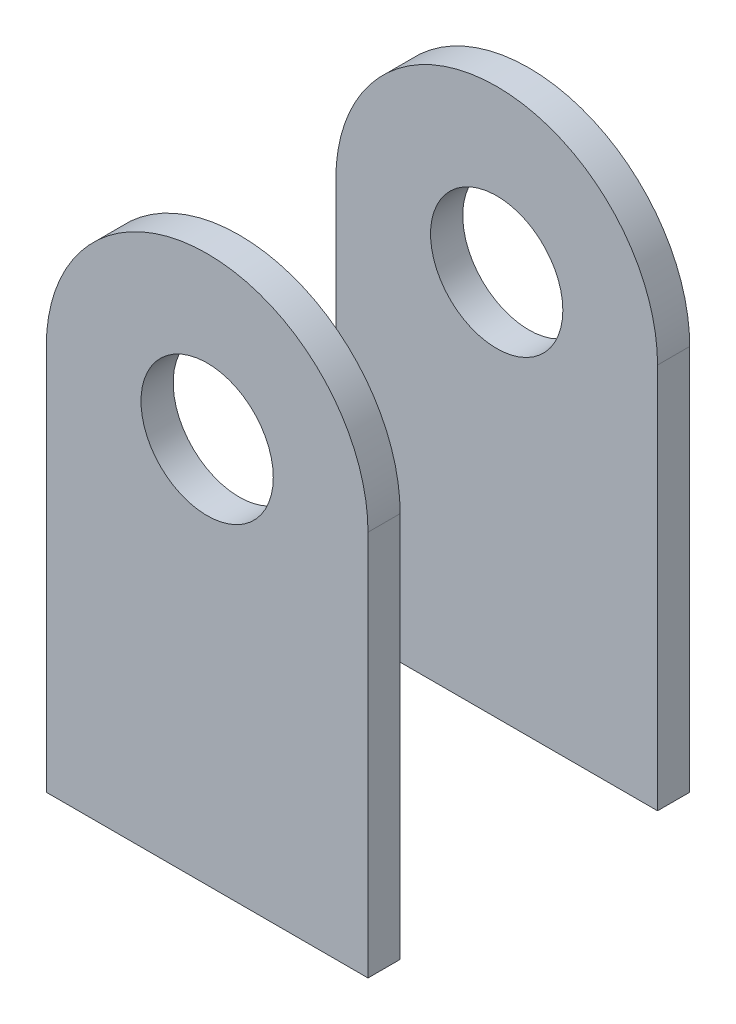
ISO-10303-21;
HEADER;
FILE_DESCRIPTION(('STEP AP214'),'2;1');
FILE_NAME('part.step','',(''),(''),'','','');
FILE_SCHEMA(('AUTOMOTIVE_DESIGN { 1 0 10303 214 1 1 1 1 }'));
ENDSEC;
DATA;
#1=APPLICATION_CONTEXT('core data for automotive mechanical design processes');
#2=APPLICATION_PROTOCOL_DEFINITION('international standard','automotive_design',2000,#1);
#3=PRODUCT_CONTEXT('',#1,'mechanical');
#4=PRODUCT('Part','Part','',(#3));
#5=PRODUCT_RELATED_PRODUCT_CATEGORY('part','',(#4));
#6=PRODUCT_DEFINITION_FORMATION('','',#4);
#7=PRODUCT_DEFINITION_CONTEXT('part definition',#1,'design');
#8=PRODUCT_DEFINITION('design','',#6,#7);
#9=PRODUCT_DEFINITION_SHAPE('','',#8);
#10=(LENGTH_UNIT() NAMED_UNIT(*) SI_UNIT(.MILLI.,.METRE.));
#11=(NAMED_UNIT(*) PLANE_ANGLE_UNIT() SI_UNIT($,.RADIAN.));
#12=(NAMED_UNIT(*) SI_UNIT($,.STERADIAN.) SOLID_ANGLE_UNIT());
#13=UNCERTAINTY_MEASURE_WITH_UNIT(LENGTH_MEASURE(1.E-05),#10,'distance_accuracy_value','');
#14=(GEOMETRIC_REPRESENTATION_CONTEXT(3) GLOBAL_UNCERTAINTY_ASSIGNED_CONTEXT((#13)) GLOBAL_UNIT_ASSIGNED_CONTEXT((#10,
#11,#12)) REPRESENTATION_CONTEXT('',''));
#15=CARTESIAN_POINT('',(0.,0.,0.));
#16=DIRECTION('',(0.,0.,1.));
#17=DIRECTION('',(1.,0.,0.));
#18=AXIS2_PLACEMENT_3D('',#15,#16,#17);
#19=CARTESIAN_POINT('',(0.,-19.05,-7.9375));
#20=DIRECTION('',(0.,1.,0.));
#21=DIRECTION('',(0.,0.,1.));
#22=AXIS2_PLACEMENT_3D('',#19,#20,#21);
#23=PLANE('',#22);
#24=DIRECTION('',(-1.,0.,0.));
#25=VECTOR('',#24,1.);
#26=CARTESIAN_POINT('',(0.,-19.05,-6.35));
#27=LINE('',#26,#25);
#28=CARTESIAN_POINT('',(7.9375,-19.05,-6.35));
#29=VERTEX_POINT('',#28);
#30=CARTESIAN_POINT('',(-7.9375,-19.05,-6.35));
#31=VERTEX_POINT('',#30);
#32=EDGE_CURVE('E121',#29,#31,#27,.T.);
#33=ORIENTED_EDGE('',*,*,#32,.T.);
#34=DIRECTION('',(0.,0.,1.));
#35=VECTOR('',#34,1.);
#36=CARTESIAN_POINT('',(-7.9375,-19.05,-7.9375));
#37=LINE('',#36,#35);
#38=CARTESIAN_POINT('',(-7.9375,-19.05,-7.9375));
#39=VERTEX_POINT('',#38);
#40=EDGE_CURVE('E12',#39,#31,#37,.T.);
#41=ORIENTED_EDGE('',*,*,#40,.F.);
#42=DIRECTION('',(-1.,0.,0.));
#43=VECTOR('',#42,1.);
#44=CARTESIAN_POINT('',(0.,-19.05,-7.9375));
#45=LINE('',#44,#43);
#46=CARTESIAN_POINT('',(7.9375,-19.05,-7.9375));
#47=VERTEX_POINT('',#46);
#48=EDGE_CURVE('E110',#47,#39,#45,.T.);
#49=ORIENTED_EDGE('',*,*,#48,.F.);
#50=DIRECTION('',(0.,0.,1.));
#51=VECTOR('',#50,1.);
#52=CARTESIAN_POINT('',(7.9375,-19.05,-7.9375));
#53=LINE('',#52,#51);
#54=EDGE_CURVE('E56',#47,#29,#53,.T.);
#55=ORIENTED_EDGE('',*,*,#54,.T.);
#56=EDGE_LOOP('',(#33,#41,#49,#55));
#57=FACE_BOUND('',#56,.T.);
#58=ADVANCED_FACE('F53',(#57),#23,.F.);
#59=CARTESIAN_POINT('',(-7.9375,0.,-7.9375));
#60=DIRECTION('',(1.,0.,0.));
#61=DIRECTION('',(0.,1.,0.));
#62=AXIS2_PLACEMENT_3D('',#59,#60,#61);
#63=PLANE('',#62);
#64=DIRECTION('',(0.,1.,0.));
#65=VECTOR('',#64,1.);
#66=CARTESIAN_POINT('',(-7.9375,0.,-6.35));
#67=LINE('',#66,#65);
#68=CARTESIAN_POINT('',(-7.9375,0.,-6.35));
#69=VERTEX_POINT('',#68);
#70=EDGE_CURVE('E92',#31,#69,#67,.T.);
#71=ORIENTED_EDGE('',*,*,#70,.T.);
#72=DIRECTION('',(0.,0.,1.));
#73=VECTOR('',#72,1.);
#74=CARTESIAN_POINT('',(-7.9375,0.,-7.9375));
#75=LINE('',#74,#73);
#76=CARTESIAN_POINT('',(-7.9375,0.,-7.9375));
#77=VERTEX_POINT('',#76);
#78=EDGE_CURVE('E62',#77,#69,#75,.T.);
#79=ORIENTED_EDGE('',*,*,#78,.F.);
#80=DIRECTION('',(0.,1.,0.));
#81=VECTOR('',#80,1.);
#82=CARTESIAN_POINT('',(-7.9375,0.,-7.9375));
#83=LINE('',#82,#81);
#84=EDGE_CURVE('E70',#39,#77,#83,.T.);
#85=ORIENTED_EDGE('',*,*,#84,.F.);
#86=ORIENTED_EDGE('',*,*,#40,.T.);
#87=EDGE_LOOP('',(#71,#79,#85,#86));
#88=FACE_BOUND('',#87,.T.);
#89=ADVANCED_FACE('F135',(#88),#63,.F.);
#90=CARTESIAN_POINT('',(0.,0.,-7.9375));
#91=DIRECTION('',(0.,0.,1.));
#92=DIRECTION('',(1.,0.,0.));
#93=AXIS2_PLACEMENT_3D('',#90,#91,#92);
#94=CYLINDRICAL_SURFACE('',#93,7.9375);
#95=CARTESIAN_POINT('',(0.,0.,-6.35));
#96=DIRECTION('',(0.,0.,1.));
#97=DIRECTION('',(1.,0.,0.));
#98=AXIS2_PLACEMENT_3D('',#95,#96,#97);
#99=CIRCLE('',#98,7.9375);
#100=CARTESIAN_POINT('',(7.9375,0.,-6.35));
#101=VERTEX_POINT('',#100);
#102=EDGE_CURVE('E104',#101,#69,#99,.T.);
#103=ORIENTED_EDGE('',*,*,#102,.F.);
#104=DIRECTION('',(0.,0.,1.));
#105=VECTOR('',#104,1.);
#106=CARTESIAN_POINT('',(7.9375,0.,-7.9375));
#107=LINE('',#106,#105);
#108=CARTESIAN_POINT('',(7.9375,0.,-7.9375));
#109=VERTEX_POINT('',#108);
#110=EDGE_CURVE('E101',#109,#101,#107,.T.);
#111=ORIENTED_EDGE('',*,*,#110,.F.);
#112=CARTESIAN_POINT('',(0.,0.,-7.9375));
#113=DIRECTION('',(0.,0.,1.));
#114=DIRECTION('',(1.,0.,0.));
#115=AXIS2_PLACEMENT_3D('',#112,#113,#114);
#116=CIRCLE('',#115,7.9375);
#117=EDGE_CURVE('E103',#109,#77,#116,.T.);
#118=ORIENTED_EDGE('',*,*,#117,.T.);
#119=ORIENTED_EDGE('',*,*,#78,.T.);
#120=EDGE_LOOP('',(#103,#111,#118,#119));
#121=FACE_BOUND('',#120,.T.);
#122=ADVANCED_FACE('F102',(#121),#94,.T.);
#123=CARTESIAN_POINT('',(7.9375,0.,-7.9375));
#124=DIRECTION('',(-1.,0.,0.));
#125=DIRECTION('',(0.,-1.,0.));
#126=AXIS2_PLACEMENT_3D('',#123,#124,#125);
#127=PLANE('',#126);
#128=DIRECTION('',(0.,-1.,0.));
#129=VECTOR('',#128,1.);
#130=CARTESIAN_POINT('',(7.9375,0.,-6.35));
#131=LINE('',#130,#129);
#132=EDGE_CURVE('E124',#101,#29,#131,.T.);
#133=ORIENTED_EDGE('',*,*,#132,.T.);
#134=ORIENTED_EDGE('',*,*,#54,.F.);
#135=DIRECTION('',(0.,-1.,0.));
#136=VECTOR('',#135,1.);
#137=CARTESIAN_POINT('',(7.9375,0.,-7.9375));
#138=LINE('',#137,#136);
#139=EDGE_CURVE('E98',#109,#47,#138,.T.);
#140=ORIENTED_EDGE('',*,*,#139,.F.);
#141=ORIENTED_EDGE('',*,*,#110,.T.);
#142=EDGE_LOOP('',(#133,#134,#140,#141));
#143=FACE_BOUND('',#142,.T.);
#144=ADVANCED_FACE('F107',(#143),#127,.F.);
#145=CARTESIAN_POINT('',(0.,0.,-7.9375));
#146=DIRECTION('',(0.,0.,1.));
#147=DIRECTION('',(1.,0.,0.));
#148=AXIS2_PLACEMENT_3D('',#145,#146,#147);
#149=CYLINDRICAL_SURFACE('',#148,3.2639);
#150=CARTESIAN_POINT('',(0.,0.,-7.9375));
#151=DIRECTION('',(0.,0.,1.));
#152=DIRECTION('',(1.,0.,0.));
#153=AXIS2_PLACEMENT_3D('',#150,#151,#152);
#154=CIRCLE('',#153,3.2639);
#155=CARTESIAN_POINT('',(3.2639,0.,-7.9375));
#156=VERTEX_POINT('',#155);
#157=EDGE_CURVE('E115',#156,#156,#154,.T.);
#158=ORIENTED_EDGE('',*,*,#157,.F.);
#159=EDGE_LOOP('',(#158));
#160=FACE_BOUND('',#159,.T.);
#161=CARTESIAN_POINT('',(0.,0.,-6.35));
#162=DIRECTION('',(0.,0.,1.));
#163=DIRECTION('',(1.,0.,0.));
#164=AXIS2_PLACEMENT_3D('',#161,#162,#163);
#165=CIRCLE('',#164,3.2639);
#166=CARTESIAN_POINT('',(3.2639,0.,-6.35));
#167=VERTEX_POINT('',#166);
#168=EDGE_CURVE('E128',#167,#167,#165,.T.);
#169=ORIENTED_EDGE('',*,*,#168,.T.);
#170=EDGE_LOOP('',(#169));
#171=FACE_BOUND('',#170,.T.);
#172=ADVANCED_FACE('F143',(#160,#171),#149,.F.);
#173=CARTESIAN_POINT('',(0.,0.,-7.9375));
#174=DIRECTION('',(0.,0.,1.));
#175=DIRECTION('',(1.,0.,0.));
#176=AXIS2_PLACEMENT_3D('',#173,#174,#175);
#177=PLANE('',#176);
#178=ORIENTED_EDGE('',*,*,#48,.T.);
#179=ORIENTED_EDGE('',*,*,#84,.T.);
#180=ORIENTED_EDGE('',*,*,#117,.F.);
#181=ORIENTED_EDGE('',*,*,#139,.T.);
#182=EDGE_LOOP('',(#178,#179,#180,#181));
#183=FACE_BOUND('',#182,.T.);
#184=ORIENTED_EDGE('',*,*,#157,.T.);
#185=EDGE_LOOP('',(#184));
#186=FACE_BOUND('',#185,.T.);
#187=ADVANCED_FACE('F112',(#183,#186),#177,.F.);
#188=CARTESIAN_POINT('',(0.,0.,-6.35));
#189=DIRECTION('',(0.,0.,1.));
#190=DIRECTION('',(1.,0.,0.));
#191=AXIS2_PLACEMENT_3D('',#188,#189,#190);
#192=PLANE('',#191);
#193=ORIENTED_EDGE('',*,*,#32,.F.);
#194=ORIENTED_EDGE('',*,*,#132,.F.);
#195=ORIENTED_EDGE('',*,*,#102,.T.);
#196=ORIENTED_EDGE('',*,*,#70,.F.);
#197=EDGE_LOOP('',(#193,#194,#195,#196));
#198=FACE_BOUND('',#197,.T.);
#199=ORIENTED_EDGE('',*,*,#168,.F.);
#200=EDGE_LOOP('',(#199));
#201=FACE_BOUND('',#200,.T.);
#202=ADVANCED_FACE('F136',(#198,#201),#192,.T.);
#203=CLOSED_SHELL('',(#58,#89,#122,#144,#172,#187,#202));
#204=MANIFOLD_SOLID_BREP('B2',#203);
#205=CARTESIAN_POINT('',(0.,-19.05,7.9375));
#206=DIRECTION('',(0.,-1.,0.));
#207=DIRECTION('',(0.,0.,-1.));
#208=AXIS2_PLACEMENT_3D('',#205,#206,#207);
#209=PLANE('',#208);
#210=DIRECTION('',(-1.,0.,0.));
#211=VECTOR('',#210,1.);
#212=CARTESIAN_POINT('',(0.,-19.05,6.35));
#213=LINE('',#212,#211);
#214=CARTESIAN_POINT('',(7.9375,-19.05,6.35));
#215=VERTEX_POINT('',#214);
#216=CARTESIAN_POINT('',(-7.9375,-19.05,6.35));
#217=VERTEX_POINT('',#216);
#218=EDGE_CURVE('E278',#215,#217,#213,.T.);
#219=ORIENTED_EDGE('',*,*,#218,.F.);
#220=DIRECTION('',(0.,0.,-1.));
#221=VECTOR('',#220,1.);
#222=CARTESIAN_POINT('',(7.9375,-19.05,7.9375));
#223=LINE('',#222,#221);
#224=CARTESIAN_POINT('',(7.9375,-19.05,7.9375));
#225=VERTEX_POINT('',#224);
#226=EDGE_CURVE('E51',#225,#215,#223,.T.);
#227=ORIENTED_EDGE('',*,*,#226,.F.);
#228=DIRECTION('',(-1.,0.,0.));
#229=VECTOR('',#228,1.);
#230=CARTESIAN_POINT('',(0.,-19.05,7.9375));
#231=LINE('',#230,#229);
#232=CARTESIAN_POINT('',(-7.9375,-19.05,7.9375));
#233=VERTEX_POINT('',#232);
#234=EDGE_CURVE('E269',#225,#233,#231,.T.);
#235=ORIENTED_EDGE('',*,*,#234,.T.);
#236=DIRECTION('',(0.,0.,-1.));
#237=VECTOR('',#236,1.);
#238=CARTESIAN_POINT('',(-7.9375,-19.05,7.9375));
#239=LINE('',#238,#237);
#240=EDGE_CURVE('E226',#233,#217,#239,.T.);
#241=ORIENTED_EDGE('',*,*,#240,.T.);
#242=EDGE_LOOP('',(#219,#227,#235,#241));
#243=FACE_BOUND('',#242,.T.);
#244=ADVANCED_FACE('F210',(#243),#209,.T.);
#245=CARTESIAN_POINT('',(7.9375,0.,7.9375));
#246=DIRECTION('',(1.,0.,0.));
#247=DIRECTION('',(0.,1.,0.));
#248=AXIS2_PLACEMENT_3D('',#245,#246,#247);
#249=PLANE('',#248);
#250=DIRECTION('',(0.,-1.,0.));
#251=VECTOR('',#250,1.);
#252=CARTESIAN_POINT('',(7.9375,0.,6.35));
#253=LINE('',#252,#251);
#254=CARTESIAN_POINT('',(7.9375,0.,6.35));
#255=VERTEX_POINT('',#254);
#256=EDGE_CURVE('E258',#255,#215,#253,.T.);
#257=ORIENTED_EDGE('',*,*,#256,.F.);
#258=DIRECTION('',(0.,0.,-1.));
#259=VECTOR('',#258,1.);
#260=CARTESIAN_POINT('',(7.9375,0.,7.9375));
#261=LINE('',#260,#259);
#262=CARTESIAN_POINT('',(7.9375,0.,7.9375));
#263=VERTEX_POINT('',#262);
#264=EDGE_CURVE('E218',#263,#255,#261,.T.);
#265=ORIENTED_EDGE('',*,*,#264,.F.);
#266=DIRECTION('',(0.,-1.,0.));
#267=VECTOR('',#266,1.);
#268=CARTESIAN_POINT('',(7.9375,0.,7.9375));
#269=LINE('',#268,#267);
#270=EDGE_CURVE('E256',#263,#225,#269,.T.);
#271=ORIENTED_EDGE('',*,*,#270,.T.);
#272=ORIENTED_EDGE('',*,*,#226,.T.);
#273=EDGE_LOOP('',(#257,#265,#271,#272));
#274=FACE_BOUND('',#273,.T.);
#275=ADVANCED_FACE('F254',(#274),#249,.T.);
#276=CARTESIAN_POINT('',(0.,0.,7.9375));
#277=DIRECTION('',(0.,0.,-1.));
#278=DIRECTION('',(-1.,0.,0.));
#279=AXIS2_PLACEMENT_3D('',#276,#277,#278);
#280=CYLINDRICAL_SURFACE('',#279,7.9375);
#281=CARTESIAN_POINT('',(0.,0.,6.35));
#282=DIRECTION('',(0.,0.,1.));
#283=DIRECTION('',(1.,0.,0.));
#284=AXIS2_PLACEMENT_3D('',#281,#282,#283);
#285=CIRCLE('',#284,7.9375);
#286=CARTESIAN_POINT('',(-7.9375,0.,6.35));
#287=VERTEX_POINT('',#286);
#288=EDGE_CURVE('E281',#255,#287,#285,.T.);
#289=ORIENTED_EDGE('',*,*,#288,.T.);
#290=DIRECTION('',(0.,0.,-1.));
#291=VECTOR('',#290,1.);
#292=CARTESIAN_POINT('',(-7.9375,0.,7.9375));
#293=LINE('',#292,#291);
#294=CARTESIAN_POINT('',(-7.9375,0.,7.9375));
#295=VERTEX_POINT('',#294);
#296=EDGE_CURVE('E240',#295,#287,#293,.T.);
#297=ORIENTED_EDGE('',*,*,#296,.F.);
#298=CARTESIAN_POINT('',(0.,0.,7.9375));
#299=DIRECTION('',(0.,0.,1.));
#300=DIRECTION('',(1.,0.,0.));
#301=AXIS2_PLACEMENT_3D('',#298,#299,#300);
#302=CIRCLE('',#301,7.9375);
#303=EDGE_CURVE('E261',#263,#295,#302,.T.);
#304=ORIENTED_EDGE('',*,*,#303,.F.);
#305=ORIENTED_EDGE('',*,*,#264,.T.);
#306=EDGE_LOOP('',(#289,#297,#304,#305));
#307=FACE_BOUND('',#306,.T.);
#308=ADVANCED_FACE('F262',(#307),#280,.T.);
#309=CARTESIAN_POINT('',(-7.9375,0.,7.9375));
#310=DIRECTION('',(-1.,0.,0.));
#311=DIRECTION('',(0.,-1.,0.));
#312=AXIS2_PLACEMENT_3D('',#309,#310,#311);
#313=PLANE('',#312);
#314=DIRECTION('',(0.,1.,0.));
#315=VECTOR('',#314,1.);
#316=CARTESIAN_POINT('',(-7.9375,0.,6.35));
#317=LINE('',#316,#315);
#318=EDGE_CURVE('E283',#217,#287,#317,.T.);
#319=ORIENTED_EDGE('',*,*,#318,.F.);
#320=ORIENTED_EDGE('',*,*,#240,.F.);
#321=DIRECTION('',(0.,1.,0.));
#322=VECTOR('',#321,1.);
#323=CARTESIAN_POINT('',(-7.9375,0.,7.9375));
#324=LINE('',#323,#322);
#325=EDGE_CURVE('E265',#233,#295,#324,.T.);
#326=ORIENTED_EDGE('',*,*,#325,.T.);
#327=ORIENTED_EDGE('',*,*,#296,.T.);
#328=EDGE_LOOP('',(#319,#320,#326,#327));
#329=FACE_BOUND('',#328,.T.);
#330=ADVANCED_FACE('F295',(#329),#313,.T.);
#331=CARTESIAN_POINT('',(0.,0.,7.9375));
#332=DIRECTION('',(0.,0.,-1.));
#333=DIRECTION('',(-1.,0.,0.));
#334=AXIS2_PLACEMENT_3D('',#331,#332,#333);
#335=CYLINDRICAL_SURFACE('',#334,3.2639);
#336=CARTESIAN_POINT('',(0.,0.,7.9375));
#337=DIRECTION('',(0.,0.,1.));
#338=DIRECTION('',(1.,0.,0.));
#339=AXIS2_PLACEMENT_3D('',#336,#337,#338);
#340=CIRCLE('',#339,3.2639);
#341=CARTESIAN_POINT('',(3.2639,0.,7.9375));
#342=VERTEX_POINT('',#341);
#343=EDGE_CURVE('E275',#342,#342,#340,.T.);
#344=ORIENTED_EDGE('',*,*,#343,.T.);
#345=EDGE_LOOP('',(#344));
#346=FACE_BOUND('',#345,.T.);
#347=CARTESIAN_POINT('',(0.,0.,6.35));
#348=DIRECTION('',(0.,0.,1.));
#349=DIRECTION('',(1.,0.,0.));
#350=AXIS2_PLACEMENT_3D('',#347,#348,#349);
#351=CIRCLE('',#350,3.2639);
#352=CARTESIAN_POINT('',(3.2639,0.,6.35));
#353=VERTEX_POINT('',#352);
#354=EDGE_CURVE('E271',#353,#353,#351,.T.);
#355=ORIENTED_EDGE('',*,*,#354,.F.);
#356=EDGE_LOOP('',(#355));
#357=FACE_BOUND('',#356,.T.);
#358=ADVANCED_FACE('F293',(#346,#357),#335,.F.);
#359=CARTESIAN_POINT('',(0.,0.,7.9375));
#360=DIRECTION('',(0.,0.,1.));
#361=DIRECTION('',(1.,0.,0.));
#362=AXIS2_PLACEMENT_3D('',#359,#360,#361);
#363=PLANE('',#362);
#364=ORIENTED_EDGE('',*,*,#234,.F.);
#365=ORIENTED_EDGE('',*,*,#270,.F.);
#366=ORIENTED_EDGE('',*,*,#303,.T.);
#367=ORIENTED_EDGE('',*,*,#325,.F.);
#368=EDGE_LOOP('',(#364,#365,#366,#367));
#369=FACE_BOUND('',#368,.T.);
#370=ORIENTED_EDGE('',*,*,#343,.F.);
#371=EDGE_LOOP('',(#370));
#372=FACE_BOUND('',#371,.T.);
#373=ADVANCED_FACE('F267',(#369,#372),#363,.T.);
#374=CARTESIAN_POINT('',(0.,0.,6.35));
#375=DIRECTION('',(0.,0.,1.));
#376=DIRECTION('',(1.,0.,0.));
#377=AXIS2_PLACEMENT_3D('',#374,#375,#376);
#378=PLANE('',#377);
#379=ORIENTED_EDGE('',*,*,#218,.T.);
#380=ORIENTED_EDGE('',*,*,#318,.T.);
#381=ORIENTED_EDGE('',*,*,#288,.F.);
#382=ORIENTED_EDGE('',*,*,#256,.T.);
#383=EDGE_LOOP('',(#379,#380,#381,#382));
#384=FACE_BOUND('',#383,.T.);
#385=ORIENTED_EDGE('',*,*,#354,.T.);
#386=EDGE_LOOP('',(#385));
#387=FACE_BOUND('',#386,.T.);
#388=ADVANCED_FACE('F291',(#384,#387),#378,.F.);
#389=CLOSED_SHELL('',(#244,#275,#308,#330,#358,#373,#388));
#390=MANIFOLD_SOLID_BREP('B6',#389);
#391=ADVANCED_BREP_SHAPE_REPRESENTATION('',(#18,#204,#390),#14);
#392=SHAPE_DEFINITION_REPRESENTATION(#9,#391);
ENDSEC;
END-ISO-10303-21;
